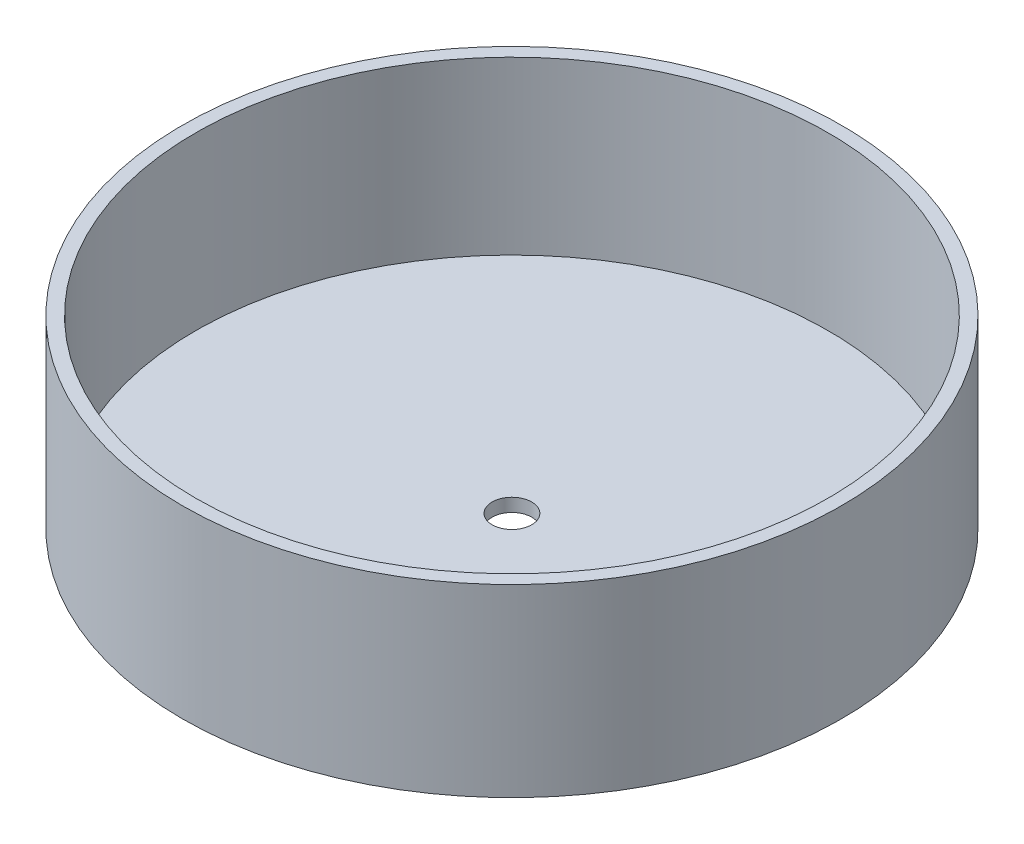
ISO-10303-21;
HEADER;
FILE_DESCRIPTION(('STEP AP214'),'2;1');
FILE_NAME('part.step','',(''),(''),'','','');
FILE_SCHEMA(('AUTOMOTIVE_DESIGN { 1 0 10303 214 1 1 1 1 }'));
ENDSEC;
DATA;
#1=APPLICATION_CONTEXT('core data for automotive mechanical design processes');
#2=APPLICATION_PROTOCOL_DEFINITION('international standard','automotive_design',2000,#1);
#3=PRODUCT_CONTEXT('',#1,'mechanical');
#4=PRODUCT('Part','Part','',(#3));
#5=PRODUCT_RELATED_PRODUCT_CATEGORY('part','',(#4));
#6=PRODUCT_DEFINITION_FORMATION('','',#4);
#7=PRODUCT_DEFINITION_CONTEXT('part definition',#1,'design');
#8=PRODUCT_DEFINITION('design','',#6,#7);
#9=PRODUCT_DEFINITION_SHAPE('','',#8);
#10=(LENGTH_UNIT() NAMED_UNIT(*) SI_UNIT(.MILLI.,.METRE.));
#11=(NAMED_UNIT(*) PLANE_ANGLE_UNIT() SI_UNIT($,.RADIAN.));
#12=(NAMED_UNIT(*) SI_UNIT($,.STERADIAN.) SOLID_ANGLE_UNIT());
#13=UNCERTAINTY_MEASURE_WITH_UNIT(LENGTH_MEASURE(1.E-05),#10,'distance_accuracy_value','');
#14=(GEOMETRIC_REPRESENTATION_CONTEXT(3) GLOBAL_UNCERTAINTY_ASSIGNED_CONTEXT((#13)) GLOBAL_UNIT_ASSIGNED_CONTEXT((#10,
#11,#12)) REPRESENTATION_CONTEXT('',''));
#15=CARTESIAN_POINT('',(0.,0.,0.));
#16=DIRECTION('',(0.,0.,1.));
#17=DIRECTION('',(1.,0.,0.));
#18=AXIS2_PLACEMENT_3D('',#15,#16,#17);
#19=CARTESIAN_POINT('',(0.,35.,0.));
#20=DIRECTION('',(0.,-1.,0.));
#21=DIRECTION('',(0.,0.,-1.));
#22=AXIS2_PLACEMENT_3D('',#19,#20,#21);
#23=CYLINDRICAL_SURFACE('',#22,125.);
#24=CARTESIAN_POINT('',(0.,35.,0.));
#25=DIRECTION('',(0.,1.,0.));
#26=DIRECTION('',(0.,0.,1.));
#27=AXIS2_PLACEMENT_3D('',#24,#25,#26);
#28=CIRCLE('',#27,125.);
#29=CARTESIAN_POINT('',(0.,35.,125.));
#30=VERTEX_POINT('',#29);
#31=EDGE_CURVE('E10',#30,#30,#28,.T.);
#32=ORIENTED_EDGE('',*,*,#31,.F.);
#33=EDGE_LOOP('',(#32));
#34=FACE_BOUND('',#33,.T.);
#35=CARTESIAN_POINT('',(0.,-35.,0.));
#36=DIRECTION('',(0.,1.,0.));
#37=DIRECTION('',(0.,0.,1.));
#38=AXIS2_PLACEMENT_3D('',#35,#36,#37);
#39=CIRCLE('',#38,125.);
#40=CARTESIAN_POINT('',(0.,-35.,125.));
#41=VERTEX_POINT('',#40);
#42=EDGE_CURVE('E37',#41,#41,#39,.T.);
#43=ORIENTED_EDGE('',*,*,#42,.T.);
#44=EDGE_LOOP('',(#43));
#45=FACE_BOUND('',#44,.T.);
#46=ADVANCED_FACE('F34',(#34,#45),#23,.T.);
#47=CARTESIAN_POINT('',(0.,35.,0.));
#48=DIRECTION('',(0.,1.,0.));
#49=DIRECTION('',(0.,0.,1.));
#50=AXIS2_PLACEMENT_3D('',#47,#48,#49);
#51=PLANE('',#50);
#52=CARTESIAN_POINT('',(0.,35.,0.));
#53=DIRECTION('',(0.,1.,0.));
#54=DIRECTION('',(0.,0.,1.));
#55=AXIS2_PLACEMENT_3D('',#52,#53,#54);
#56=CIRCLE('',#55,120.);
#57=CARTESIAN_POINT('',(0.,35.,120.));
#58=VERTEX_POINT('',#57);
#59=EDGE_CURVE('E46',#58,#58,#56,.T.);
#60=ORIENTED_EDGE('',*,*,#59,.F.);
#61=EDGE_LOOP('',(#60));
#62=FACE_BOUND('',#61,.T.);
#63=ORIENTED_EDGE('',*,*,#31,.T.);
#64=EDGE_LOOP('',(#63));
#65=FACE_BOUND('',#64,.T.);
#66=ADVANCED_FACE('F79',(#62,#65),#51,.T.);
#67=CARTESIAN_POINT('',(0.,-35.,0.));
#68=DIRECTION('',(0.,1.,0.));
#69=DIRECTION('',(0.,0.,1.));
#70=AXIS2_PLACEMENT_3D('',#67,#68,#69);
#71=PLANE('',#70);
#72=CARTESIAN_POINT('',(0.,-35.,0.));
#73=DIRECTION('',(0.,1.,0.));
#74=DIRECTION('',(0.,0.,1.));
#75=AXIS2_PLACEMENT_3D('',#72,#73,#74);
#76=CIRCLE('',#75,7.5);
#77=CARTESIAN_POINT('',(0.,-35.,7.5));
#78=VERTEX_POINT('',#77);
#79=EDGE_CURVE('E49',#78,#78,#76,.T.);
#80=ORIENTED_EDGE('',*,*,#79,.T.);
#81=EDGE_LOOP('',(#80));
#82=FACE_BOUND('',#81,.T.);
#83=ORIENTED_EDGE('',*,*,#42,.F.);
#84=EDGE_LOOP('',(#83));
#85=FACE_BOUND('',#84,.T.);
#86=ADVANCED_FACE('F58',(#82,#85),#71,.F.);
#87=CARTESIAN_POINT('',(0.,-30.,0.));
#88=DIRECTION('',(0.,1.,0.));
#89=DIRECTION('',(0.,0.,1.));
#90=AXIS2_PLACEMENT_3D('',#87,#88,#89);
#91=CYLINDRICAL_SURFACE('',#90,120.);
#92=CARTESIAN_POINT('',(0.,-30.,0.));
#93=DIRECTION('',(0.,1.,0.));
#94=DIRECTION('',(0.,0.,1.));
#95=AXIS2_PLACEMENT_3D('',#92,#93,#94);
#96=CIRCLE('',#95,120.);
#97=CARTESIAN_POINT('',(0.,-30.,120.));
#98=VERTEX_POINT('',#97);
#99=EDGE_CURVE('E44',#98,#98,#96,.T.);
#100=ORIENTED_EDGE('',*,*,#99,.F.);
#101=EDGE_LOOP('',(#100));
#102=FACE_BOUND('',#101,.T.);
#103=ORIENTED_EDGE('',*,*,#59,.T.);
#104=EDGE_LOOP('',(#103));
#105=FACE_BOUND('',#104,.T.);
#106=ADVANCED_FACE('F70',(#102,#105),#91,.F.);
#107=CARTESIAN_POINT('',(0.,-30.,0.));
#108=DIRECTION('',(0.,1.,0.));
#109=DIRECTION('',(0.,0.,1.));
#110=AXIS2_PLACEMENT_3D('',#107,#108,#109);
#111=PLANE('',#110);
#112=CARTESIAN_POINT('',(0.,-30.,0.));
#113=DIRECTION('',(0.,1.,0.));
#114=DIRECTION('',(0.,0.,1.));
#115=AXIS2_PLACEMENT_3D('',#112,#113,#114);
#116=CIRCLE('',#115,7.5);
#117=CARTESIAN_POINT('',(0.,-30.,7.5));
#118=VERTEX_POINT('',#117);
#119=EDGE_CURVE('E52',#118,#118,#116,.T.);
#120=ORIENTED_EDGE('',*,*,#119,.F.);
#121=EDGE_LOOP('',(#120));
#122=FACE_BOUND('',#121,.T.);
#123=ORIENTED_EDGE('',*,*,#99,.T.);
#124=EDGE_LOOP('',(#123));
#125=FACE_BOUND('',#124,.T.);
#126=ADVANCED_FACE('F64',(#122,#125),#111,.T.);
#127=CARTESIAN_POINT('',(0.,-35.,0.));
#128=DIRECTION('',(0.,1.,0.));
#129=DIRECTION('',(0.,0.,1.));
#130=AXIS2_PLACEMENT_3D('',#127,#128,#129);
#131=CYLINDRICAL_SURFACE('',#130,7.5);
#132=ORIENTED_EDGE('',*,*,#79,.F.);
#133=EDGE_LOOP('',(#132));
#134=FACE_BOUND('',#133,.T.);
#135=ORIENTED_EDGE('',*,*,#119,.T.);
#136=EDGE_LOOP('',(#135));
#137=FACE_BOUND('',#136,.T.);
#138=ADVANCED_FACE('F61',(#134,#137),#131,.F.);
#139=CLOSED_SHELL('',(#46,#66,#86,#106,#126,#138));
#140=MANIFOLD_SOLID_BREP('B2',#139);
#141=ADVANCED_BREP_SHAPE_REPRESENTATION('',(#18,#140),#14);
#142=SHAPE_DEFINITION_REPRESENTATION(#9,#141);
ENDSEC;
END-ISO-10303-21;
